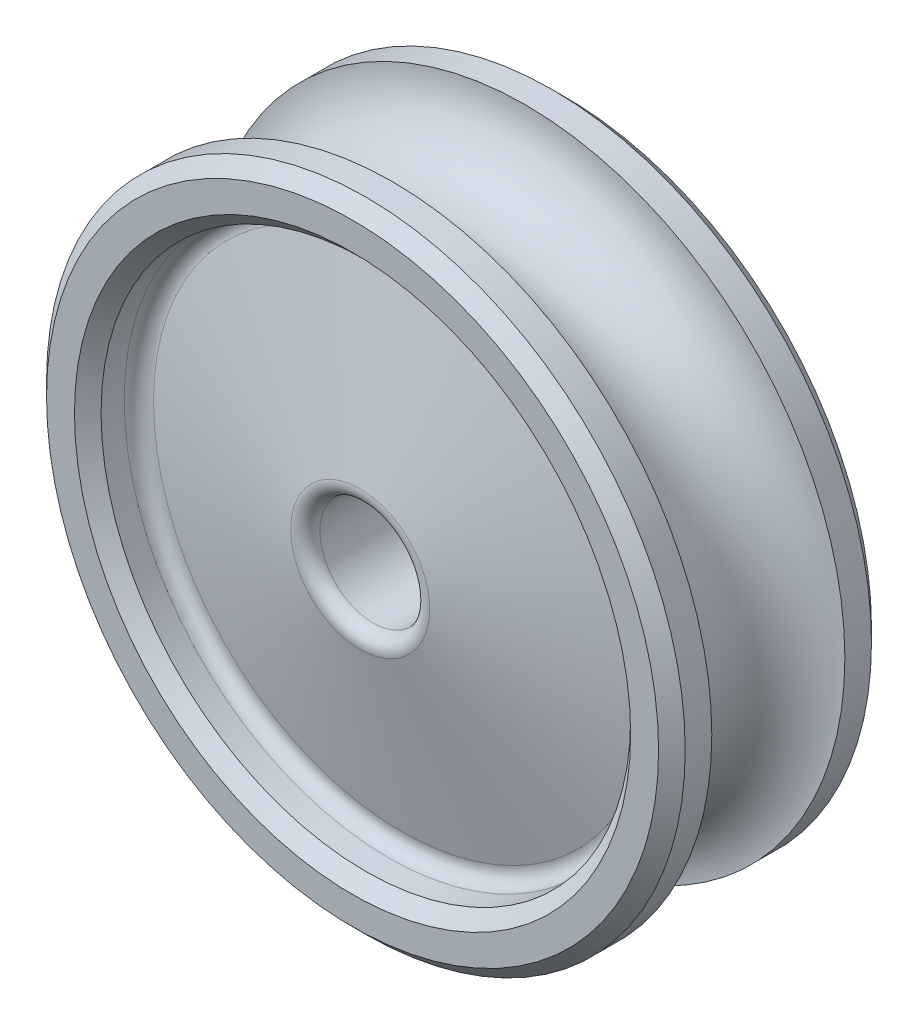
ISO-10303-21;
HEADER;
FILE_DESCRIPTION(('STEP AP214'),'2;1');
FILE_NAME('part.step','',(''),(''),'','','');
FILE_SCHEMA(('AUTOMOTIVE_DESIGN { 1 0 10303 214 1 1 1 1 }'));
ENDSEC;
DATA;
#1=APPLICATION_CONTEXT('core data for automotive mechanical design processes');
#2=APPLICATION_PROTOCOL_DEFINITION('international standard','automotive_design',2000,#1);
#3=PRODUCT_CONTEXT('',#1,'mechanical');
#4=PRODUCT('Part','Part','',(#3));
#5=PRODUCT_RELATED_PRODUCT_CATEGORY('part','',(#4));
#6=PRODUCT_DEFINITION_FORMATION('','',#4);
#7=PRODUCT_DEFINITION_CONTEXT('part definition',#1,'design');
#8=PRODUCT_DEFINITION('design','',#6,#7);
#9=PRODUCT_DEFINITION_SHAPE('','',#8);
#10=(LENGTH_UNIT() NAMED_UNIT(*) SI_UNIT(.MILLI.,.METRE.));
#11=(NAMED_UNIT(*) PLANE_ANGLE_UNIT() SI_UNIT($,.RADIAN.));
#12=(NAMED_UNIT(*) SI_UNIT($,.STERADIAN.) SOLID_ANGLE_UNIT());
#13=UNCERTAINTY_MEASURE_WITH_UNIT(LENGTH_MEASURE(1.E-05),#10,'distance_accuracy_value','');
#14=(GEOMETRIC_REPRESENTATION_CONTEXT(3) GLOBAL_UNCERTAINTY_ASSIGNED_CONTEXT((#13)) GLOBAL_UNIT_ASSIGNED_CONTEXT((#10,
#11,#12)) REPRESENTATION_CONTEXT('',''));
#15=CARTESIAN_POINT('',(0.,0.,0.));
#16=DIRECTION('',(0.,0.,1.));
#17=DIRECTION('',(1.,0.,0.));
#18=AXIS2_PLACEMENT_3D('',#15,#16,#17);
#19=CARTESIAN_POINT('',(0.,0.,101.6));
#20=DIRECTION('',(0.,0.,-1.));
#21=DIRECTION('',(-1.,0.,0.));
#22=AXIS2_PLACEMENT_3D('',#19,#20,#21);
#23=CYLINDRICAL_SURFACE('',#22,152.4);
#24=CARTESIAN_POINT('',(0.,0.,95.2500000000001));
#25=DIRECTION('',(0.,0.,1.));
#26=DIRECTION('',(1.,0.,0.));
#27=AXIS2_PLACEMENT_3D('',#24,#25,#26);
#28=CIRCLE('',#27,152.4);
#29=CARTESIAN_POINT('',(152.4,0.,95.2500000000001));
#30=VERTEX_POINT('',#29);
#31=EDGE_CURVE('E79',#30,#30,#28,.F.);
#32=ORIENTED_EDGE('',*,*,#31,.T.);
#33=EDGE_LOOP('',(#32));
#34=FACE_BOUND('',#33,.T.);
#35=CARTESIAN_POINT('',(0.,0.,82.55));
#36=DIRECTION('',(0.,0.,-1.));
#37=DIRECTION('',(-1.,0.,0.));
#38=AXIS2_PLACEMENT_3D('',#35,#36,#37);
#39=CIRCLE('',#38,152.4);
#40=CARTESIAN_POINT('',(0.,152.4,82.55));
#41=VERTEX_POINT('',#40);
#42=EDGE_CURVE('E53',#41,#41,#39,.T.);
#43=ORIENTED_EDGE('',*,*,#42,.F.);
#44=EDGE_LOOP('',(#43));
#45=FACE_BOUND('',#44,.T.);
#46=ADVANCED_FACE('F33',(#34,#45),#23,.T.);
#47=CARTESIAN_POINT('',(0.,0.,101.6));
#48=DIRECTION('',(0.,0.,1.));
#49=DIRECTION('',(1.,0.,0.));
#50=AXIS2_PLACEMENT_3D('',#47,#48,#49);
#51=PLANE('',#50);
#52=CARTESIAN_POINT('',(0.,0.,101.6));
#53=DIRECTION('',(0.,0.,1.));
#54=DIRECTION('',(1.,0.,0.));
#55=AXIS2_PLACEMENT_3D('',#52,#53,#54);
#56=CIRCLE('',#55,132.719282727114);
#57=CARTESIAN_POINT('',(132.719282727114,0.,101.6));
#58=VERTEX_POINT('',#57);
#59=EDGE_CURVE('E73',#58,#58,#56,.F.);
#60=ORIENTED_EDGE('',*,*,#59,.T.);
#61=EDGE_LOOP('',(#60));
#62=FACE_BOUND('',#61,.T.);
#63=CARTESIAN_POINT('',(0.,0.,101.6));
#64=DIRECTION('',(0.,0.,1.));
#65=DIRECTION('',(1.,0.,0.));
#66=AXIS2_PLACEMENT_3D('',#63,#64,#65);
#67=CIRCLE('',#66,146.05);
#68=CARTESIAN_POINT('',(146.05,0.,101.6));
#69=VERTEX_POINT('',#68);
#70=EDGE_CURVE('E70',#69,#69,#67,.T.);
#71=ORIENTED_EDGE('',*,*,#70,.T.);
#72=EDGE_LOOP('',(#71));
#73=FACE_BOUND('',#72,.T.);
#74=ADVANCED_FACE('F125',(#62,#73),#51,.T.);
#75=CARTESIAN_POINT('',(0.,0.,50.8));
#76=DIRECTION('',(0.,0.,1.));
#77=DIRECTION('',(1.,0.,0.));
#78=AXIS2_PLACEMENT_3D('',#75,#76,#77);
#79=TOROIDAL_SURFACE('',#78,152.4,31.75);
#80=ORIENTED_EDGE('',*,*,#42,.T.);
#81=CARTESIAN_POINT('',(0.,152.4,50.8));
#82=DIRECTION('',(1.,0.,0.));
#83=DIRECTION('',(0.,0.,-1.));
#84=AXIS2_PLACEMENT_3D('',#81,#82,#83);
#85=CIRCLE('',#84,31.75);
#86=CARTESIAN_POINT('',(0.,152.4,19.05));
#87=VERTEX_POINT('',#86);
#88=EDGE_CURVE('E48',#41,#87,#85,.T.);
#89=ORIENTED_EDGE('',*,*,#88,.T.);
#90=CARTESIAN_POINT('',(0.,0.,19.05));
#91=DIRECTION('',(0.,0.,1.));
#92=DIRECTION('',(1.,0.,0.));
#93=AXIS2_PLACEMENT_3D('',#90,#91,#92);
#94=CIRCLE('',#93,152.4);
#95=EDGE_CURVE('E51',#87,#87,#94,.T.);
#96=ORIENTED_EDGE('',*,*,#95,.T.);
#97=ORIENTED_EDGE('',*,*,#88,.F.);
#98=EDGE_LOOP('',(#80,#89,#96,#97));
#99=FACE_BOUND('',#98,.T.);
#100=ADVANCED_FACE('F49',(#99),#79,.F.);
#101=CARTESIAN_POINT('',(0.,0.,0.));
#102=DIRECTION('',(0.,0.,1.));
#103=DIRECTION('',(1.,0.,0.));
#104=AXIS2_PLACEMENT_3D('',#101,#102,#103);
#105=PLANE('',#104);
#106=CARTESIAN_POINT('',(0.,0.,0.));
#107=DIRECTION('',(0.,0.,1.));
#108=DIRECTION('',(1.,0.,0.));
#109=AXIS2_PLACEMENT_3D('',#106,#107,#108);
#110=CIRCLE('',#109,132.719282727114);
#111=CARTESIAN_POINT('',(132.719282727114,0.,0.));
#112=VERTEX_POINT('',#111);
#113=EDGE_CURVE('E64',#112,#112,#110,.T.);
#114=ORIENTED_EDGE('',*,*,#113,.T.);
#115=EDGE_LOOP('',(#114));
#116=FACE_BOUND('',#115,.T.);
#117=CARTESIAN_POINT('',(0.,0.,0.));
#118=DIRECTION('',(0.,0.,1.));
#119=DIRECTION('',(1.,0.,0.));
#120=AXIS2_PLACEMENT_3D('',#117,#118,#119);
#121=CIRCLE('',#120,146.05);
#122=CARTESIAN_POINT('',(146.05,0.,0.));
#123=VERTEX_POINT('',#122);
#124=EDGE_CURVE('E61',#123,#123,#121,.F.);
#125=ORIENTED_EDGE('',*,*,#124,.T.);
#126=EDGE_LOOP('',(#125));
#127=FACE_BOUND('',#126,.T.);
#128=ADVANCED_FACE('F137',(#116,#127),#105,.F.);
#129=CARTESIAN_POINT('',(0.,0.,6.34999999999999));
#130=DIRECTION('',(0.,0.,1.));
#131=DIRECTION('',(1.,0.,0.));
#132=AXIS2_PLACEMENT_3D('',#129,#130,#131);
#133=CIRCLE('',#132,152.4);
#134=CARTESIAN_POINT('',(152.4,0.,6.34999999999999));
#135=VERTEX_POINT('',#134);
#136=EDGE_CURVE('E67',#135,#135,#133,.T.);
#137=ORIENTED_EDGE('',*,*,#136,.T.);
#138=EDGE_LOOP('',(#137));
#139=FACE_BOUND('',#138,.T.);
#140=ORIENTED_EDGE('',*,*,#95,.F.);
#141=EDGE_LOOP('',(#140));
#142=FACE_BOUND('',#141,.T.);
#143=ADVANCED_FACE('F115',(#139,#142),#23,.T.);
#144=CARTESIAN_POINT('',(0.,0.,0.));
#145=DIRECTION('',(0.,0.,1.));
#146=DIRECTION('',(1.,0.,0.));
#147=AXIS2_PLACEMENT_3D('',#144,#145,#146);
#148=CYLINDRICAL_SURFACE('',#147,25.4);
#149=CARTESIAN_POINT('',(0.,0.,91.771001344169));
#150=DIRECTION('',(0.,0.,-1.));
#151=DIRECTION('',(-1.,0.,0.));
#152=AXIS2_PLACEMENT_3D('',#149,#150,#151);
#153=CIRCLE('',#152,25.4);
#154=CARTESIAN_POINT('',(-25.4,0.,91.771001344169));
#155=VERTEX_POINT('',#154);
#156=EDGE_CURVE('E97',#155,#155,#153,.F.);
#157=ORIENTED_EDGE('',*,*,#156,.T.);
#158=EDGE_LOOP('',(#157));
#159=FACE_BOUND('',#158,.T.);
#160=CARTESIAN_POINT('',(0.,0.,9.82899865583102));
#161=DIRECTION('',(0.,0.,1.));
#162=DIRECTION('',(1.,0.,0.));
#163=AXIS2_PLACEMENT_3D('',#160,#161,#162);
#164=CIRCLE('',#163,25.4);
#165=CARTESIAN_POINT('',(25.4,0.,9.82899865583102));
#166=VERTEX_POINT('',#165);
#167=EDGE_CURVE('E94',#166,#166,#164,.F.);
#168=ORIENTED_EDGE('',*,*,#167,.T.);
#169=EDGE_LOOP('',(#168));
#170=FACE_BOUND('',#169,.T.);
#171=ADVANCED_FACE('F111',(#159,#170),#148,.F.);
#172=CARTESIAN_POINT('',(0.,0.,25.4));
#173=DIRECTION('',(0.,0.,1.));
#174=DIRECTION('',(1.,0.,0.));
#175=AXIS2_PLACEMENT_3D('',#172,#173,#174);
#176=CONICAL_SURFACE('',#175,126.369282727114,1.34142455994423);
#177=CARTESIAN_POINT('',(0.,0.,3.64530880141849));
#178=DIRECTION('',(0.,0.,-1.));
#179=DIRECTION('',(-1.,0.,0.));
#180=AXIS2_PLACEMENT_3D('',#177,#178,#179);
#181=CIRCLE('',#180,33.1937727606641);
#182=CARTESIAN_POINT('',(33.1937727606641,0.,3.64530880141849));
#183=VERTEX_POINT('',#182);
#184=EDGE_CURVE('E11',#183,#183,#181,.F.);
#185=CARTESIAN_POINT('',(0.,0.,23.5803038186621));
#186=DIRECTION('',(0.,0.,1.));
#187=DIRECTION('',(1.,0.,0.));
#188=AXIS2_PLACEMENT_3D('',#185,#186,#187);
#189=CIRCLE('',#188,118.57550996645);
#190=CARTESIAN_POINT('',(118.57550996645,0.,23.5803038186621));
#191=VERTEX_POINT('',#190);
#192=EDGE_CURVE('E88',#191,#191,#189,.F.);
#193=CARTESIAN_POINT('',(33.1937727606641,0.,3.64530880141849));
#194=CARTESIAN_POINT('',(34.0831658565577,0.,3.85296499951478));
#195=CARTESIAN_POINT('',(34.9725589524513,0.,4.06062119761107));
#196=CARTESIAN_POINT('',(36.7513451442385,0.,4.47593359380364));
#197=CARTESIAN_POINT('',(37.6407382401321,0.,4.68358979189993));
#198=CARTESIAN_POINT('',(39.4195244319193,0.,5.0989021880925));
#199=CARTESIAN_POINT('',(40.3089175278129,0.,5.30655838618879));
#200=CARTESIAN_POINT('',(42.0877037196001,0.,5.72187078238137));
#201=CARTESIAN_POINT('',(42.9770968154937,0.,5.92952698047765));
#202=CARTESIAN_POINT('',(44.7558830072809,0.,6.34483937667023));
#203=CARTESIAN_POINT('',(45.6452761031745,0.,6.55249557476651));
#204=CARTESIAN_POINT('',(47.4240622949617,0.,6.96780797095909));
#205=CARTESIAN_POINT('',(48.3134553908553,0.,7.17546416905537));
#206=CARTESIAN_POINT('',(50.0922415826425,0.,7.59077656524795));
#207=CARTESIAN_POINT('',(50.9816346785361,0.,7.79843276334423));
#208=CARTESIAN_POINT('',(52.7604208703233,0.,8.21374515953681));
#209=CARTESIAN_POINT('',(53.6498139662169,0.,8.4214013576331));
#210=CARTESIAN_POINT('',(55.4286001580042,0.,8.83671375382567));
#211=CARTESIAN_POINT('',(56.3179932538978,0.,9.04436995192196));
#212=CARTESIAN_POINT('',(58.096779445685,0.,9.45968234811453));
#213=CARTESIAN_POINT('',(58.9861725415786,0.,9.66733854621082));
#214=CARTESIAN_POINT('',(60.7649587333658,0.,10.0826509424034));
#215=CARTESIAN_POINT('',(61.6543518292594,0.,10.2903071404997));
#216=CARTESIAN_POINT('',(63.4331380210466,0.,10.7056195366923));
#217=CARTESIAN_POINT('',(64.3225311169402,0.,10.9132757347885));
#218=CARTESIAN_POINT('',(66.1013173087274,0.,11.3285881309811));
#219=CARTESIAN_POINT('',(66.990710404621,0.,11.5362443290774));
#220=CARTESIAN_POINT('',(68.7694965964082,0.,11.95155672527));
#221=CARTESIAN_POINT('',(69.6588896923018,0.,12.1592129233663));
#222=CARTESIAN_POINT('',(71.437675884089,0.,12.5745253195588));
#223=CARTESIAN_POINT('',(72.3270689799826,0.,12.7821815176551));
#224=CARTESIAN_POINT('',(74.1058551717698,0.,13.1974939138477));
#225=CARTESIAN_POINT('',(74.9952482676634,0.,13.405150111944));
#226=CARTESIAN_POINT('',(76.7740344594506,0.,13.8204625081366));
#227=CARTESIAN_POINT('',(77.6634275553442,0.,14.0281187062328));
#228=CARTESIAN_POINT('',(79.4422137471314,0.,14.4434311024254));
#229=CARTESIAN_POINT('',(80.331606843025,0.,14.6510873005217));
#230=CARTESIAN_POINT('',(82.1103930348122,0.,15.0663996967143));
#231=CARTESIAN_POINT('',(82.9997861307058,0.,15.2740558948106));
#232=CARTESIAN_POINT('',(84.778572322493,0.,15.6893682910031));
#233=CARTESIAN_POINT('',(85.6679654183867,0.,15.8970244890994));
#234=CARTESIAN_POINT('',(87.4467516101739,0.,16.312336885292));
#235=CARTESIAN_POINT('',(88.3361447060675,0.,16.5199930833883));
#236=CARTESIAN_POINT('',(90.1149308978547,0.,16.9353054795809));
#237=CARTESIAN_POINT('',(91.0043239937483,0.,17.1429616776772));
#238=CARTESIAN_POINT('',(92.7831101855355,0.,17.5582740738697));
#239=CARTESIAN_POINT('',(93.6725032814291,0.,17.765930271966));
#240=CARTESIAN_POINT('',(95.4512894732163,0.,18.1812426681586));
#241=CARTESIAN_POINT('',(96.3406825691099,0.,18.3888988662549));
#242=CARTESIAN_POINT('',(98.1194687608971,0.,18.8042112624474));
#243=CARTESIAN_POINT('',(99.0088618567907,0.,19.0118674605437));
#244=CARTESIAN_POINT('',(100.787648048578,0.,19.4271798567363));
#245=CARTESIAN_POINT('',(101.677041144472,0.,19.6348360548326));
#246=CARTESIAN_POINT('',(103.455827336259,0.,20.0501484510252));
#247=CARTESIAN_POINT('',(104.345220432152,0.,20.2578046491215));
#248=CARTESIAN_POINT('',(106.12400662394,0.,20.673117045314));
#249=CARTESIAN_POINT('',(107.013399719833,0.,20.8807732434103));
#250=CARTESIAN_POINT('',(108.79218591162,0.,21.2960856396029));
#251=CARTESIAN_POINT('',(109.681579007514,0.,21.5037418376992));
#252=CARTESIAN_POINT('',(111.460365199301,0.,21.9190542338918));
#253=CARTESIAN_POINT('',(112.349758295195,0.,22.126710431988));
#254=CARTESIAN_POINT('',(114.128544486982,0.,22.5420228281806));
#255=CARTESIAN_POINT('',(115.017937582876,0.,22.7496790262769));
#256=CARTESIAN_POINT('',(116.796723774663,0.,23.1649914224695));
#257=CARTESIAN_POINT('',(117.686116870556,0.,23.3726476205658));
#258=CARTESIAN_POINT('',(118.57550996645,0.,23.5803038186621));
#259=B_SPLINE_CURVE_WITH_KNOTS('',3,(#193,#194,#195,#196,#197,#198,#199,#200,#201,#202,#203,
#204,#205,#206,#207,#208,#209,#210,#211,#212,#213,#214,#215,#216,#217,#218,#219,#220,#221,#222,
#223,#224,#225,#226,#227,#228,#229,#230,#231,#232,#233,#234,#235,#236,#237,#238,#239,#240,#241,
#242,#243,#244,#245,#246,#247,#248,#249,#250,#251,#252,#253,#254,#255,#256,#257,#258),
.UNSPECIFIED.,.F.,.F.,(4,2,2,2,2,2,2,2,2,2,2,2,2,2,2,2,2,2,2,2,2,2,2,2,2,2,2,2,2,2,2,2,4),(0.,
2.73993988632582,5.47987977265163,8.21981965897745,10.9597595453033,13.6996994316291,
16.4396393179549,19.1795792042807,21.9195190906065,24.6594589769323,27.3993988632581,
30.1393387495839,32.8792786359098,35.6192185222356,38.3591584085614,41.0990982948872,
43.839038181213,46.5789780675388,49.3189179538646,52.0588578401904,54.7987977265163,
57.5387376128421,60.2786774991679,63.0186173854937,65.7585572718195,68.4984971581453,
71.2384370444711,73.9783769307969,76.7183168171228,79.4582567034485,82.1981965897744,
84.9381364761002,87.678076362426),.UNSPECIFIED.);
#260=EDGE_CURVE('BSEAM114',#183,#191,#259,.T.);
#261=ORIENTED_EDGE('',*,*,#184,.T.);
#262=ORIENTED_EDGE('',*,*,#192,.T.);
#263=ORIENTED_EDGE('',*,*,#260,.T.);
#264=ORIENTED_EDGE('',*,*,#260,.F.);
#265=EDGE_LOOP('',(#261,#263,#262,#264));
#266=FACE_BOUND('',#265,.T.);
#267=ADVANCED_FACE('F114',(#266),#176,.T.);
#268=CARTESIAN_POINT('',(0.,0.,0.));
#269=DIRECTION('',(0.,0.,-1.));
#270=DIRECTION('',(-1.,0.,0.));
#271=AXIS2_PLACEMENT_3D('',#268,#269,#270);
#272=CYLINDRICAL_SURFACE('',#271,126.369282727114);
#273=CARTESIAN_POINT('',(0.,0.,17.3966139642495));
#274=DIRECTION('',(0.,0.,-1.));
#275=DIRECTION('',(-1.,0.,0.));
#276=AXIS2_PLACEMENT_3D('',#273,#274,#275);
#277=CIRCLE('',#276,126.369282727114);
#278=CARTESIAN_POINT('',(-126.369282727114,0.,17.3966139642495));
#279=VERTEX_POINT('',#278);
#280=EDGE_CURVE('E91',#279,#279,#277,.F.);
#281=ORIENTED_EDGE('',*,*,#280,.T.);
#282=EDGE_LOOP('',(#281));
#283=FACE_BOUND('',#282,.T.);
#284=CARTESIAN_POINT('',(0.,0.,6.34999999999994));
#285=DIRECTION('',(0.,0.,1.));
#286=DIRECTION('',(1.,0.,0.));
#287=AXIS2_PLACEMENT_3D('',#284,#285,#286);
#288=CIRCLE('',#287,126.369282727114);
#289=CARTESIAN_POINT('',(126.369282727114,0.,6.34999999999994));
#290=VERTEX_POINT('',#289);
#291=EDGE_CURVE('E58',#290,#290,#288,.F.);
#292=ORIENTED_EDGE('',*,*,#291,.T.);
#293=EDGE_LOOP('',(#292));
#294=FACE_BOUND('',#293,.T.);
#295=ADVANCED_FACE('F179',(#283,#294),#272,.F.);
#296=CARTESIAN_POINT('',(0.,0.,76.2));
#297=DIRECTION('',(0.,0.,-1.));
#298=DIRECTION('',(1.,0.,0.));
#299=AXIS2_PLACEMENT_3D('',#296,#297,#298);
#300=CONICAL_SURFACE('',#299,126.369282727114,1.34142455994423);
#301=CARTESIAN_POINT('',(0.,0.,97.9546911985815));
#302=DIRECTION('',(0.,0.,1.));
#303=DIRECTION('',(1.,0.,0.));
#304=AXIS2_PLACEMENT_3D('',#301,#302,#303);
#305=CIRCLE('',#304,33.1937727606641);
#306=CARTESIAN_POINT('',(33.1937727606641,0.,97.9546911985815));
#307=VERTEX_POINT('',#306);
#308=EDGE_CURVE('E41',#307,#307,#305,.F.);
#309=CARTESIAN_POINT('',(0.,0.,78.0196961813379));
#310=DIRECTION('',(0.,0.,-1.));
#311=DIRECTION('',(-1.,0.,0.));
#312=AXIS2_PLACEMENT_3D('',#309,#310,#311);
#313=CIRCLE('',#312,118.57550996645);
#314=CARTESIAN_POINT('',(118.57550996645,0.,78.0196961813379));
#315=VERTEX_POINT('',#314);
#316=EDGE_CURVE('E85',#315,#315,#313,.F.);
#317=CARTESIAN_POINT('',(33.1937727606641,0.,97.9546911985815));
#318=CARTESIAN_POINT('',(34.0831658565577,0.,97.7470350004852));
#319=CARTESIAN_POINT('',(34.9725589524513,0.,97.5393788023889));
#320=CARTESIAN_POINT('',(36.7513451442385,0.,97.1240664061963));
#321=CARTESIAN_POINT('',(37.6407382401321,0.,96.9164102081001));
#322=CARTESIAN_POINT('',(39.4195244319193,0.,96.5010978119075));
#323=CARTESIAN_POINT('',(40.3089175278129,0.,96.2934416138112));
#324=CARTESIAN_POINT('',(42.0877037196001,0.,95.8781292176186));
#325=CARTESIAN_POINT('',(42.9770968154937,0.,95.6704730195223));
#326=CARTESIAN_POINT('',(44.755883007281,0.,95.2551606233298));
#327=CARTESIAN_POINT('',(45.6452761031746,0.,95.0475044252335));
#328=CARTESIAN_POINT('',(47.4240622949618,0.,94.6321920290409));
#329=CARTESIAN_POINT('',(48.3134553908554,0.,94.4245358309446));
#330=CARTESIAN_POINT('',(50.0922415826426,0.,94.009223434752));
#331=CARTESIAN_POINT('',(50.9816346785362,0.,93.8015672366558));
#332=CARTESIAN_POINT('',(52.7604208703234,0.,93.3862548404632));
#333=CARTESIAN_POINT('',(53.649813966217,0.,93.1785986423669));
#334=CARTESIAN_POINT('',(55.4286001580042,0.,92.7632862461743));
#335=CARTESIAN_POINT('',(56.3179932538978,0.,92.555630048078));
#336=CARTESIAN_POINT('',(58.096779445685,0.,92.1403176518855));
#337=CARTESIAN_POINT('',(58.9861725415786,0.,91.9326614537892));
#338=CARTESIAN_POINT('',(60.7649587333658,0.,91.5173490575966));
#339=CARTESIAN_POINT('',(61.6543518292594,0.,91.3096928595003));
#340=CARTESIAN_POINT('',(63.4331380210466,0.,90.8943804633077));
#341=CARTESIAN_POINT('',(64.3225311169402,0.,90.6867242652115));
#342=CARTESIAN_POINT('',(66.1013173087274,0.,90.2714118690189));
#343=CARTESIAN_POINT('',(66.990710404621,0.,90.0637556709226));
#344=CARTESIAN_POINT('',(68.7694965964082,0.,89.64844327473));
#345=CARTESIAN_POINT('',(69.6588896923018,0.,89.4407870766337));
#346=CARTESIAN_POINT('',(71.437675884089,0.,89.0254746804411));
#347=CARTESIAN_POINT('',(72.3270689799827,0.,88.8178184823448));
#348=CARTESIAN_POINT('',(74.1058551717699,0.,88.4025060861523));
#349=CARTESIAN_POINT('',(74.9952482676635,0.,88.194849888056));
#350=CARTESIAN_POINT('',(76.7740344594507,0.,87.7795374918634));
#351=CARTESIAN_POINT('',(77.6634275553443,0.,87.5718812937671));
#352=CARTESIAN_POINT('',(79.4422137471315,0.,87.1565688975746));
#353=CARTESIAN_POINT('',(80.3316068430251,0.,86.9489126994783));
#354=CARTESIAN_POINT('',(82.1103930348123,0.,86.5336003032857));
#355=CARTESIAN_POINT('',(82.9997861307059,0.,86.3259441051894));
#356=CARTESIAN_POINT('',(84.7785723224931,0.,85.9106317089968));
#357=CARTESIAN_POINT('',(85.6679654183867,0.,85.7029755109005));
#358=CARTESIAN_POINT('',(87.4467516101739,0.,85.287663114708));
#359=CARTESIAN_POINT('',(88.3361447060675,0.,85.0800069166117));
#360=CARTESIAN_POINT('',(90.1149308978547,0.,84.6646945204191));
#361=CARTESIAN_POINT('',(91.0043239937483,0.,84.4570383223228));
#362=CARTESIAN_POINT('',(92.7831101855355,0.,84.0417259261302));
#363=CARTESIAN_POINT('',(93.6725032814291,0.,83.834069728034));
#364=CARTESIAN_POINT('',(95.4512894732163,0.,83.4187573318414));
#365=CARTESIAN_POINT('',(96.3406825691099,0.,83.2111011337451));
#366=CARTESIAN_POINT('',(98.1194687608971,0.,82.7957887375525));
#367=CARTESIAN_POINT('',(99.0088618567907,0.,82.5881325394562));
#368=CARTESIAN_POINT('',(100.787648048578,0.,82.1728201432637));
#369=CARTESIAN_POINT('',(101.677041144472,0.,81.9651639451674));
#370=CARTESIAN_POINT('',(103.455827336259,0.,81.5498515489748));
#371=CARTESIAN_POINT('',(104.345220432152,0.,81.3421953508785));
#372=CARTESIAN_POINT('',(106.12400662394,0.,80.926882954686));
#373=CARTESIAN_POINT('',(107.013399719833,0.,80.7192267565897));
#374=CARTESIAN_POINT('',(108.79218591162,0.,80.3039143603971));
#375=CARTESIAN_POINT('',(109.681579007514,0.,80.0962581623008));
#376=CARTESIAN_POINT('',(111.460365199301,0.,79.6809457661082));
#377=CARTESIAN_POINT('',(112.349758295195,0.,79.4732895680119));
#378=CARTESIAN_POINT('',(114.128544486982,0.,79.0579771718193));
#379=CARTESIAN_POINT('',(115.017937582876,0.,78.8503209737231));
#380=CARTESIAN_POINT('',(116.796723774663,0.,78.4350085775305));
#381=CARTESIAN_POINT('',(117.686116870556,0.,78.2273523794342));
#382=CARTESIAN_POINT('',(118.57550996645,0.,78.0196961813379));
#383=B_SPLINE_CURVE_WITH_KNOTS('',3,(#317,#318,#319,#320,#321,#322,#323,#324,#325,#326,#327,
#328,#329,#330,#331,#332,#333,#334,#335,#336,#337,#338,#339,#340,#341,#342,#343,#344,#345,#346,
#347,#348,#349,#350,#351,#352,#353,#354,#355,#356,#357,#358,#359,#360,#361,#362,#363,#364,#365,
#366,#367,#368,#369,#370,#371,#372,#373,#374,#375,#376,#377,#378,#379,#380,#381,#382),
.UNSPECIFIED.,.F.,.F.,(4,2,2,2,2,2,2,2,2,2,2,2,2,2,2,2,2,2,2,2,2,2,2,2,2,2,2,2,2,2,2,2,4),(0.,
2.73993988632582,5.47987977265163,8.21981965897745,10.9597595453033,13.6996994316291,
16.4396393179549,19.1795792042807,21.9195190906065,24.6594589769323,27.3993988632581,
30.139338749584,32.8792786359098,35.6192185222356,38.3591584085614,41.0990982948872,
43.839038181213,46.5789780675388,49.3189179538646,52.0588578401905,54.7987977265163,
57.5387376128421,60.2786774991679,63.0186173854937,65.7585572718195,68.4984971581454,
71.2384370444712,73.978376930797,76.7183168171228,79.4582567034486,82.1981965897744,
84.9381364761002,87.678076362426),.UNSPECIFIED.);
#384=EDGE_CURVE('BSEAM102',#307,#315,#383,.T.);
#385=ORIENTED_EDGE('',*,*,#308,.T.);
#386=ORIENTED_EDGE('',*,*,#316,.T.);
#387=ORIENTED_EDGE('',*,*,#384,.T.);
#388=ORIENTED_EDGE('',*,*,#384,.F.);
#389=EDGE_LOOP('',(#385,#387,#386,#388));
#390=FACE_BOUND('',#389,.T.);
#391=ADVANCED_FACE('F102',(#390),#300,.T.);
#392=CARTESIAN_POINT('',(0.,0.,101.6));
#393=DIRECTION('',(0.,0.,1.));
#394=DIRECTION('',(-1.,0.,0.));
#395=AXIS2_PLACEMENT_3D('',#392,#393,#394);
#396=CYLINDRICAL_SURFACE('',#395,126.369282727114);
#397=CARTESIAN_POINT('',(0.,0.,84.2033860357505));
#398=DIRECTION('',(0.,0.,-1.));
#399=DIRECTION('',(-1.,0.,0.));
#400=AXIS2_PLACEMENT_3D('',#397,#398,#399);
#401=CIRCLE('',#400,126.369282727114);
#402=CARTESIAN_POINT('',(-126.369282727114,0.,84.2033860357505));
#403=VERTEX_POINT('',#402);
#404=EDGE_CURVE('E82',#403,#403,#401,.T.);
#405=ORIENTED_EDGE('',*,*,#404,.T.);
#406=EDGE_LOOP('',(#405));
#407=FACE_BOUND('',#406,.T.);
#408=CARTESIAN_POINT('',(0.,0.,95.25));
#409=DIRECTION('',(0.,0.,1.));
#410=DIRECTION('',(1.,0.,0.));
#411=AXIS2_PLACEMENT_3D('',#408,#409,#410);
#412=CIRCLE('',#411,126.369282727114);
#413=CARTESIAN_POINT('',(126.369282727114,0.,95.25));
#414=VERTEX_POINT('',#413);
#415=EDGE_CURVE('E76',#414,#414,#412,.T.);
#416=ORIENTED_EDGE('',*,*,#415,.T.);
#417=EDGE_LOOP('',(#416));
#418=FACE_BOUND('',#417,.T.);
#419=ADVANCED_FACE('F159',(#407,#418),#396,.F.);
#420=CARTESIAN_POINT('',(0.,0.,6.34999999999994));
#421=DIRECTION('',(0.,0.,-1.));
#422=DIRECTION('',(-1.,0.,0.));
#423=AXIS2_PLACEMENT_3D('',#420,#421,#422);
#424=CONICAL_SURFACE('',#423,126.369282727114,0.78539816339745);
#425=ORIENTED_EDGE('',*,*,#113,.F.);
#426=EDGE_LOOP('',(#425));
#427=FACE_BOUND('',#426,.T.);
#428=ORIENTED_EDGE('',*,*,#291,.F.);
#429=EDGE_LOOP('',(#428));
#430=FACE_BOUND('',#429,.T.);
#431=ADVANCED_FACE('F149',(#427,#430),#424,.F.);
#432=CARTESIAN_POINT('',(0.,0.,6.34999999999999));
#433=DIRECTION('',(0.,0.,1.));
#434=DIRECTION('',(1.,0.,0.));
#435=AXIS2_PLACEMENT_3D('',#432,#433,#434);
#436=CONICAL_SURFACE('',#435,152.4,0.785398163397453);
#437=ORIENTED_EDGE('',*,*,#124,.F.);
#438=EDGE_LOOP('',(#437));
#439=FACE_BOUND('',#438,.T.);
#440=ORIENTED_EDGE('',*,*,#136,.F.);
#441=EDGE_LOOP('',(#440));
#442=FACE_BOUND('',#441,.T.);
#443=ADVANCED_FACE('F146',(#439,#442),#436,.T.);
#444=CARTESIAN_POINT('',(0.,0.,101.6));
#445=DIRECTION('',(0.,0.,1.));
#446=DIRECTION('',(1.,0.,0.));
#447=AXIS2_PLACEMENT_3D('',#444,#445,#446);
#448=CONICAL_SURFACE('',#447,132.719282727114,0.785398163397444);
#449=CARTESIAN_POINT('',(126.369282727114,0.,95.25));
#450=CARTESIAN_POINT('',(126.435428560447,0.,95.3161458333333));
#451=CARTESIAN_POINT('',(126.501574393781,0.,95.3822916666666));
#452=CARTESIAN_POINT('',(126.633866060447,0.,95.5145833333333));
#453=CARTESIAN_POINT('',(126.700011893781,0.,95.5807291666666));
#454=CARTESIAN_POINT('',(126.832303560447,0.,95.7130208333333));
#455=CARTESIAN_POINT('',(126.898449393781,0.,95.7791666666666));
#456=CARTESIAN_POINT('',(127.030741060447,0.,95.9114583333333));
#457=CARTESIAN_POINT('',(127.096886893781,0.,95.9776041666667));
#458=CARTESIAN_POINT('',(127.229178560447,0.,96.1098958333333));
#459=CARTESIAN_POINT('',(127.295324393781,0.,96.1760416666666));
#460=CARTESIAN_POINT('',(127.427616060447,0.,96.3083333333333));
#461=CARTESIAN_POINT('',(127.493761893781,0.,96.3744791666666));
#462=CARTESIAN_POINT('',(127.626053560447,0.,96.5067708333333));
#463=CARTESIAN_POINT('',(127.692199393781,0.,96.5729166666666));
#464=CARTESIAN_POINT('',(127.824491060447,0.,96.7052083333333));
#465=CARTESIAN_POINT('',(127.890636893781,0.,96.7713541666666));
#466=CARTESIAN_POINT('',(128.022928560447,0.,96.9036458333333));
#467=CARTESIAN_POINT('',(128.089074393781,0.,96.9697916666666));
#468=CARTESIAN_POINT('',(128.221366060447,0.,97.1020833333333));
#469=CARTESIAN_POINT('',(128.287511893781,0.,97.1682291666666));
#470=CARTESIAN_POINT('',(128.419803560447,0.,97.3005208333333));
#471=CARTESIAN_POINT('',(128.485949393781,0.,97.3666666666666));
#472=CARTESIAN_POINT('',(128.618241060447,0.,97.4989583333333));
#473=CARTESIAN_POINT('',(128.684386893781,0.,97.5651041666667));
#474=CARTESIAN_POINT('',(128.816678560447,0.,97.6973958333333));
#475=CARTESIAN_POINT('',(128.882824393781,0.,97.7635416666666));
#476=CARTESIAN_POINT('',(129.015116060447,0.,97.8958333333333));
#477=CARTESIAN_POINT('',(129.081261893781,0.,97.9619791666666));
#478=CARTESIAN_POINT('',(129.213553560447,0.,98.0942708333333));
#479=CARTESIAN_POINT('',(129.279699393781,0.,98.1604166666666));
#480=CARTESIAN_POINT('',(129.411991060447,0.,98.2927083333333));
#481=CARTESIAN_POINT('',(129.478136893781,0.,98.3588541666666));
#482=CARTESIAN_POINT('',(129.610428560447,0.,98.4911458333333));
#483=CARTESIAN_POINT('',(129.676574393781,0.,98.5572916666666));
#484=CARTESIAN_POINT('',(129.808866060447,0.,98.6895833333333));
#485=CARTESIAN_POINT('',(129.875011893781,0.,98.7557291666666));
#486=CARTESIAN_POINT('',(130.007303560447,0.,98.8880208333333));
#487=CARTESIAN_POINT('',(130.073449393781,0.,98.9541666666667));
#488=CARTESIAN_POINT('',(130.205741060447,0.,99.0864583333333));
#489=CARTESIAN_POINT('',(130.271886893781,0.,99.1526041666667));
#490=CARTESIAN_POINT('',(130.404178560447,0.,99.2848958333333));
#491=CARTESIAN_POINT('',(130.470324393781,0.,99.3510416666666));
#492=CARTESIAN_POINT('',(130.602616060447,0.,99.4833333333333));
#493=CARTESIAN_POINT('',(130.668761893781,0.,99.5494791666666));
#494=CARTESIAN_POINT('',(130.801053560447,0.,99.6817708333333));
#495=CARTESIAN_POINT('',(130.867199393781,0.,99.7479166666666));
#496=CARTESIAN_POINT('',(130.999491060447,0.,99.8802083333333));
#497=CARTESIAN_POINT('',(131.065636893781,0.,99.9463541666667));
#498=CARTESIAN_POINT('',(131.197928560447,0.,100.078645833333));
#499=CARTESIAN_POINT('',(131.264074393781,0.,100.144791666667));
#500=CARTESIAN_POINT('',(131.396366060447,0.,100.277083333333));
#501=CARTESIAN_POINT('',(131.462511893781,0.,100.343229166667));
#502=CARTESIAN_POINT('',(131.594803560447,0.,100.475520833333));
#503=CARTESIAN_POINT('',(131.660949393781,0.,100.541666666667));
#504=CARTESIAN_POINT('',(131.793241060447,0.,100.673958333333));
#505=CARTESIAN_POINT('',(131.859386893781,0.,100.740104166667));
#506=CARTESIAN_POINT('',(131.991678560447,0.,100.872395833333));
#507=CARTESIAN_POINT('',(132.057824393781,0.,100.938541666667));
#508=CARTESIAN_POINT('',(132.190116060447,0.,101.070833333333));
#509=CARTESIAN_POINT('',(132.256261893781,0.,101.136979166667));
#510=CARTESIAN_POINT('',(132.388553560447,0.,101.269270833333));
#511=CARTESIAN_POINT('',(132.454699393781,0.,101.335416666667));
#512=CARTESIAN_POINT('',(132.586991060447,0.,101.467708333333));
#513=CARTESIAN_POINT('',(132.653136893781,0.,101.533854166667));
#514=CARTESIAN_POINT('',(132.719282727114,0.,101.6));
#515=B_SPLINE_CURVE_WITH_KNOTS('',3,(#449,#450,#451,#452,#453,#454,#455,#456,#457,#458,#459,
#460,#461,#462,#463,#464,#465,#466,#467,#468,#469,#470,#471,#472,#473,#474,#475,#476,#477,#478,
#479,#480,#481,#482,#483,#484,#485,#486,#487,#488,#489,#490,#491,#492,#493,#494,#495,#496,#497,
#498,#499,#500,#501,#502,#503,#504,#505,#506,#507,#508,#509,#510,#511,#512,#513,#514),
.UNSPECIFIED.,.F.,.F.,(4,2,2,2,2,2,2,2,2,2,2,2,2,2,2,2,2,2,2,2,2,2,2,2,2,2,2,2,2,2,2,2,4),(0.,
0.280633003783405,0.561266007566819,0.841899011350243,1.12253201513364,1.40316501891705,
1.68379802270046,1.96443102648387,2.24506403026729,2.52569703405069,2.8063300378341,
3.08696304161753,3.36759604540092,3.64822904918434,3.92886205296774,4.20949505675116,
4.49012806053457,4.77076106431798,5.05139406810139,5.33202707188482,5.61266007566821,
5.89329307945162,6.17392608323503,6.45455908701844,6.73519209080187,7.01582509458526,
7.29645809836868,7.5770911021521,7.8577241059355,8.13835710971891,8.41899011350232,
8.69962311728573,8.98025612106916),.UNSPECIFIED.);
#516=EDGE_CURVE('BSEAM148',#414,#58,#515,.T.);
#517=ORIENTED_EDGE('',*,*,#415,.F.);
#518=ORIENTED_EDGE('',*,*,#59,.F.);
#519=ORIENTED_EDGE('',*,*,#516,.T.);
#520=ORIENTED_EDGE('',*,*,#516,.F.);
#521=EDGE_LOOP('',(#517,#519,#518,#520));
#522=FACE_BOUND('',#521,.T.);
#523=ADVANCED_FACE('F148',(#522),#448,.F.);
#524=CARTESIAN_POINT('',(0.,0.,101.6));
#525=DIRECTION('',(0.,0.,-1.));
#526=DIRECTION('',(-1.,0.,0.));
#527=AXIS2_PLACEMENT_3D('',#524,#525,#526);
#528=CONICAL_SURFACE('',#527,146.05,0.785398163397444);
#529=ORIENTED_EDGE('',*,*,#31,.F.);
#530=EDGE_LOOP('',(#529));
#531=FACE_BOUND('',#530,.T.);
#532=ORIENTED_EDGE('',*,*,#70,.F.);
#533=EDGE_LOOP('',(#532));
#534=FACE_BOUND('',#533,.T.);
#535=ADVANCED_FACE('F156',(#531,#534),#528,.T.);
#536=CARTESIAN_POINT('',(0.,0.,84.2033860357505));
#537=DIRECTION('',(0.,0.,-1.));
#538=DIRECTION('',(-1.,0.,0.));
#539=AXIS2_PLACEMENT_3D('',#536,#537,#538);
#540=TOROIDAL_SURFACE('',#539,120.019282727114,6.35);
#541=ORIENTED_EDGE('',*,*,#316,.F.);
#542=EDGE_LOOP('',(#541));
#543=FACE_BOUND('',#542,.T.);
#544=ORIENTED_EDGE('',*,*,#404,.F.);
#545=EDGE_LOOP('',(#544));
#546=FACE_BOUND('',#545,.T.);
#547=ADVANCED_FACE('F165',(#543,#546),#540,.F.);
#548=CARTESIAN_POINT('',(0.,0.,17.3966139642495));
#549=DIRECTION('',(0.,0.,-1.));
#550=DIRECTION('',(-1.,0.,0.));
#551=AXIS2_PLACEMENT_3D('',#548,#549,#550);
#552=TOROIDAL_SURFACE('',#551,120.019282727114,6.35);
#553=ORIENTED_EDGE('',*,*,#280,.F.);
#554=EDGE_LOOP('',(#553));
#555=FACE_BOUND('',#554,.T.);
#556=ORIENTED_EDGE('',*,*,#192,.F.);
#557=EDGE_LOOP('',(#556));
#558=FACE_BOUND('',#557,.T.);
#559=ADVANCED_FACE('F108',(#555,#558),#552,.F.);
#560=CARTESIAN_POINT('',(0.,0.,91.771001344169));
#561=DIRECTION('',(0.,0.,-1.));
#562=DIRECTION('',(-1.,0.,0.));
#563=AXIS2_PLACEMENT_3D('',#560,#561,#562);
#564=TOROIDAL_SURFACE('',#563,31.75,6.35);
#565=ORIENTED_EDGE('',*,*,#308,.F.);
#566=EDGE_LOOP('',(#565));
#567=FACE_BOUND('',#566,.T.);
#568=ORIENTED_EDGE('',*,*,#156,.F.);
#569=EDGE_LOOP('',(#568));
#570=FACE_BOUND('',#569,.T.);
#571=ADVANCED_FACE('F105',(#567,#570),#564,.T.);
#572=CARTESIAN_POINT('',(0.,0.,9.82899865583102));
#573=DIRECTION('',(0.,0.,1.));
#574=DIRECTION('',(1.,0.,0.));
#575=AXIS2_PLACEMENT_3D('',#572,#573,#574);
#576=TOROIDAL_SURFACE('',#575,31.75,6.35);
#577=ORIENTED_EDGE('',*,*,#184,.F.);
#578=EDGE_LOOP('',(#577));
#579=FACE_BOUND('',#578,.T.);
#580=ORIENTED_EDGE('',*,*,#167,.F.);
#581=EDGE_LOOP('',(#580));
#582=FACE_BOUND('',#581,.T.);
#583=ADVANCED_FACE('F35',(#579,#582),#576,.T.);
#584=CLOSED_SHELL('',(#46,#74,#100,#128,#143,#171,#267,#295,#391,#419,#431,#443,#523,#535,#547,
#559,#571,#583));
#585=MANIFOLD_SOLID_BREP('B2',#584);
#586=ADVANCED_BREP_SHAPE_REPRESENTATION('',(#18,#585),#14);
#587=SHAPE_DEFINITION_REPRESENTATION(#9,#586);
ENDSEC;
END-ISO-10303-21;
